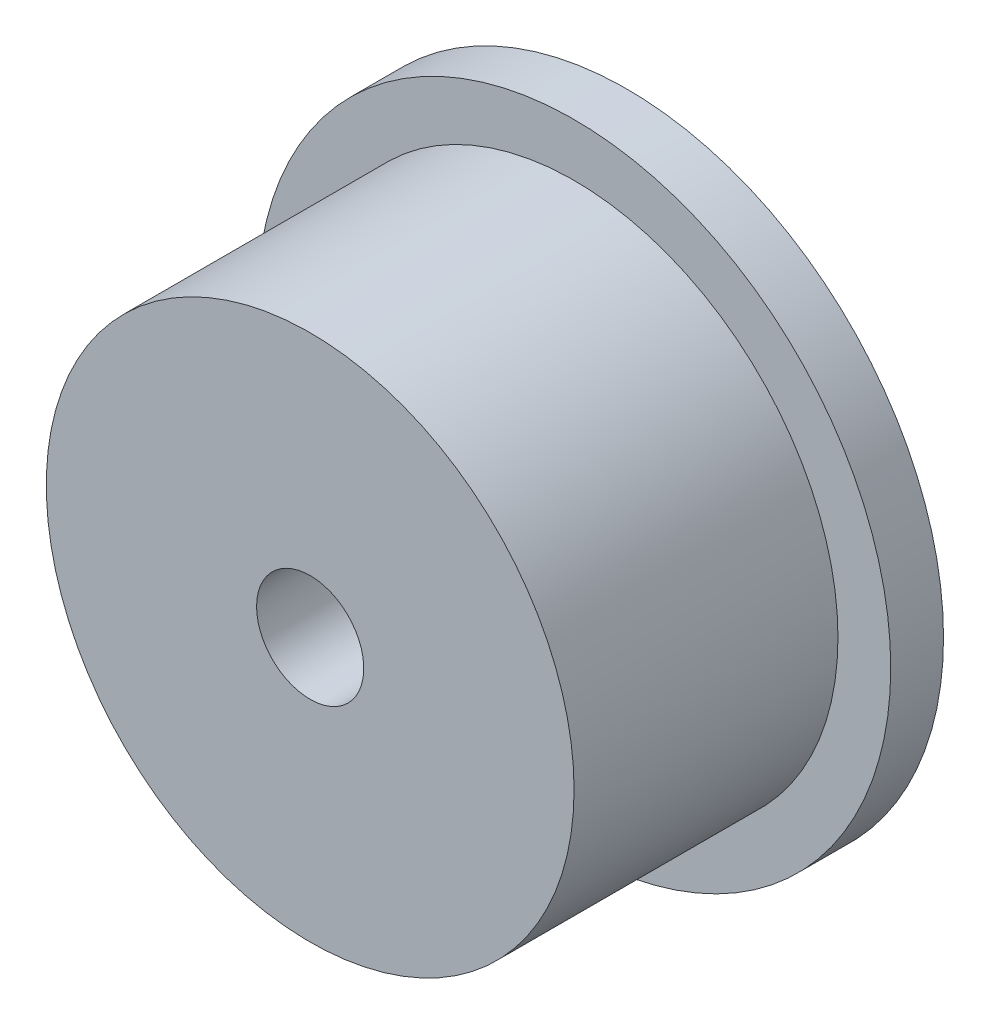
ISO-10303-21;
HEADER;
FILE_DESCRIPTION(('STEP AP214'),'2;1');
FILE_NAME('part.step','',(''),(''),'','','');
FILE_SCHEMA(('AUTOMOTIVE_DESIGN { 1 0 10303 214 1 1 1 1 }'));
ENDSEC;
DATA;
#1=APPLICATION_CONTEXT('core data for automotive mechanical design processes');
#2=APPLICATION_PROTOCOL_DEFINITION('international standard','automotive_design',2000,#1);
#3=PRODUCT_CONTEXT('',#1,'mechanical');
#4=PRODUCT('Part','Part','',(#3));
#5=PRODUCT_RELATED_PRODUCT_CATEGORY('part','',(#4));
#6=PRODUCT_DEFINITION_FORMATION('','',#4);
#7=PRODUCT_DEFINITION_CONTEXT('part definition',#1,'design');
#8=PRODUCT_DEFINITION('design','',#6,#7);
#9=PRODUCT_DEFINITION_SHAPE('','',#8);
#10=(LENGTH_UNIT() NAMED_UNIT(*) SI_UNIT(.MILLI.,.METRE.));
#11=(NAMED_UNIT(*) PLANE_ANGLE_UNIT() SI_UNIT($,.RADIAN.));
#12=(NAMED_UNIT(*) SI_UNIT($,.STERADIAN.) SOLID_ANGLE_UNIT());
#13=UNCERTAINTY_MEASURE_WITH_UNIT(LENGTH_MEASURE(1.E-05),#10,'distance_accuracy_value','');
#14=(GEOMETRIC_REPRESENTATION_CONTEXT(3) GLOBAL_UNCERTAINTY_ASSIGNED_CONTEXT((#13)) GLOBAL_UNIT_ASSIGNED_CONTEXT((#10,
#11,#12)) REPRESENTATION_CONTEXT('',''));
#15=CARTESIAN_POINT('',(0.,0.,0.));
#16=DIRECTION('',(0.,0.,1.));
#17=DIRECTION('',(1.,0.,0.));
#18=AXIS2_PLACEMENT_3D('',#15,#16,#17);
#19=CARTESIAN_POINT('',(0.,0.,-71.1204937027704));
#20=DIRECTION('',(0.,0.,-1.));
#21=DIRECTION('',(-1.,0.,0.));
#22=AXIS2_PLACEMENT_3D('',#19,#20,#21);
#23=CYLINDRICAL_SURFACE('',#22,2.5796875);
#24=CARTESIAN_POINT('',(0.,0.,-71.1204937027704));
#25=DIRECTION('',(0.,0.,-1.));
#26=DIRECTION('',(-1.,0.,0.));
#27=AXIS2_PLACEMENT_3D('',#24,#25,#26);
#28=CIRCLE('',#27,2.5796875);
#29=CARTESIAN_POINT('',(-2.5796875,0.,-71.1204937027704));
#30=VERTEX_POINT('',#29);
#31=EDGE_CURVE('E50',#30,#30,#28,.T.);
#32=ORIENTED_EDGE('',*,*,#31,.F.);
#33=EDGE_LOOP('',(#32));
#34=FACE_BOUND('',#33,.T.);
#35=CARTESIAN_POINT('',(0.,0.,-84.8872937027704));
#36=DIRECTION('',(0.,0.,-1.));
#37=DIRECTION('',(-1.,0.,0.));
#38=AXIS2_PLACEMENT_3D('',#35,#36,#37);
#39=CIRCLE('',#38,2.5796875);
#40=CARTESIAN_POINT('',(-2.5796875,0.,-84.8872937027704));
#41=VERTEX_POINT('',#40);
#42=EDGE_CURVE('E34',#41,#41,#39,.F.);
#43=ORIENTED_EDGE('',*,*,#42,.F.);
#44=EDGE_LOOP('',(#43));
#45=FACE_BOUND('',#44,.T.);
#46=ADVANCED_FACE('F30',(#34,#45),#23,.F.);
#47=CARTESIAN_POINT('',(-12.7,0.,-71.1204937027704));
#48=DIRECTION('',(0.,0.,-1.));
#49=DIRECTION('',(-1.,0.,0.));
#50=AXIS2_PLACEMENT_3D('',#47,#48,#49);
#51=PLANE('',#50);
#52=ORIENTED_EDGE('',*,*,#31,.T.);
#53=EDGE_LOOP('',(#52));
#54=FACE_BOUND('',#53,.T.);
#55=CARTESIAN_POINT('',(0.,0.,-71.1204937027704));
#56=DIRECTION('',(0.,0.,1.));
#57=DIRECTION('',(1.,0.,0.));
#58=AXIS2_PLACEMENT_3D('',#55,#56,#57);
#59=CIRCLE('',#58,12.7);
#60=CARTESIAN_POINT('',(12.7,0.,-71.1204937027704));
#61=VERTEX_POINT('',#60);
#62=EDGE_CURVE('E47',#61,#61,#59,.T.);
#63=ORIENTED_EDGE('',*,*,#62,.T.);
#64=EDGE_LOOP('',(#63));
#65=FACE_BOUND('',#64,.T.);
#66=ADVANCED_FACE('F32',(#54,#65),#51,.F.);
#67=CARTESIAN_POINT('',(0.,0.,-86.3604937027705));
#68=DIRECTION('',(0.,0.,1.));
#69=DIRECTION('',(1.,0.,0.));
#70=AXIS2_PLACEMENT_3D('',#67,#68,#69);
#71=PLANE('',#70);
#72=CARTESIAN_POINT('',(0.,0.,-86.3604937027705));
#73=DIRECTION('',(0.,0.,-1.));
#74=DIRECTION('',(-1.,0.,0.));
#75=AXIS2_PLACEMENT_3D('',#72,#73,#74);
#76=CIRCLE('',#75,4.7625);
#77=CARTESIAN_POINT('',(-4.7625,0.,-86.3604937027705));
#78=VERTEX_POINT('',#77);
#79=EDGE_CURVE('E53',#78,#78,#76,.T.);
#80=ORIENTED_EDGE('',*,*,#79,.F.);
#81=EDGE_LOOP('',(#80));
#82=FACE_BOUND('',#81,.T.);
#83=CARTESIAN_POINT('',(0.,0.,-86.3604937027705));
#84=DIRECTION('',(0.,0.,1.));
#85=DIRECTION('',(1.,0.,0.));
#86=AXIS2_PLACEMENT_3D('',#83,#84,#85);
#87=CIRCLE('',#86,15.24);
#88=CARTESIAN_POINT('',(15.24,0.,-86.3604937027705));
#89=VERTEX_POINT('',#88);
#90=EDGE_CURVE('E10',#89,#89,#87,.T.);
#91=ORIENTED_EDGE('',*,*,#90,.F.);
#92=EDGE_LOOP('',(#91));
#93=FACE_BOUND('',#92,.T.);
#94=ADVANCED_FACE('F71',(#82,#93),#71,.F.);
#95=CARTESIAN_POINT('',(0.,0.,0.));
#96=DIRECTION('',(0.,0.,1.));
#97=DIRECTION('',(1.,0.,0.));
#98=AXIS2_PLACEMENT_3D('',#95,#96,#97);
#99=CYLINDRICAL_SURFACE('',#98,15.24);
#100=CARTESIAN_POINT('',(0.,0.,-83.8204937027704));
#101=DIRECTION('',(0.,0.,1.));
#102=DIRECTION('',(1.,0.,0.));
#103=AXIS2_PLACEMENT_3D('',#100,#101,#102);
#104=CIRCLE('',#103,15.24);
#105=CARTESIAN_POINT('',(15.24,0.,-83.8204937027704));
#106=VERTEX_POINT('',#105);
#107=EDGE_CURVE('E38',#106,#106,#104,.T.);
#108=ORIENTED_EDGE('',*,*,#107,.F.);
#109=EDGE_LOOP('',(#108));
#110=FACE_BOUND('',#109,.T.);
#111=ORIENTED_EDGE('',*,*,#90,.T.);
#112=EDGE_LOOP('',(#111));
#113=FACE_BOUND('',#112,.T.);
#114=ADVANCED_FACE('F85',(#110,#113),#99,.T.);
#115=CARTESIAN_POINT('',(-15.24,0.,-83.8204937027704));
#116=DIRECTION('',(0.,0.,-1.));
#117=DIRECTION('',(-1.,0.,0.));
#118=AXIS2_PLACEMENT_3D('',#115,#116,#117);
#119=PLANE('',#118);
#120=CARTESIAN_POINT('',(0.,0.,-83.8204937027704));
#121=DIRECTION('',(0.,0.,1.));
#122=DIRECTION('',(1.,0.,0.));
#123=AXIS2_PLACEMENT_3D('',#120,#121,#122);
#124=CIRCLE('',#123,12.7);
#125=CARTESIAN_POINT('',(12.7,0.,-83.8204937027704));
#126=VERTEX_POINT('',#125);
#127=EDGE_CURVE('E42',#126,#126,#124,.T.);
#128=ORIENTED_EDGE('',*,*,#127,.F.);
#129=EDGE_LOOP('',(#128));
#130=FACE_BOUND('',#129,.T.);
#131=ORIENTED_EDGE('',*,*,#107,.T.);
#132=EDGE_LOOP('',(#131));
#133=FACE_BOUND('',#132,.T.);
#134=ADVANCED_FACE('F81',(#130,#133),#119,.F.);
#135=CARTESIAN_POINT('',(0.,0.,0.));
#136=DIRECTION('',(0.,0.,1.));
#137=DIRECTION('',(1.,0.,0.));
#138=AXIS2_PLACEMENT_3D('',#135,#136,#137);
#139=CYLINDRICAL_SURFACE('',#138,12.7);
#140=ORIENTED_EDGE('',*,*,#62,.F.);
#141=EDGE_LOOP('',(#140));
#142=FACE_BOUND('',#141,.T.);
#143=ORIENTED_EDGE('',*,*,#127,.T.);
#144=EDGE_LOOP('',(#143));
#145=FACE_BOUND('',#144,.T.);
#146=ADVANCED_FACE('F78',(#142,#145),#139,.T.);
#147=CARTESIAN_POINT('',(0.,0.,-84.8872937027704));
#148=DIRECTION('',(0.,0.,-1.));
#149=DIRECTION('',(-1.,0.,0.));
#150=AXIS2_PLACEMENT_3D('',#147,#148,#149);
#151=PLANE('',#150);
#152=CARTESIAN_POINT('',(0.,0.,-84.8872937027704));
#153=DIRECTION('',(0.,0.,-1.));
#154=DIRECTION('',(-1.,0.,0.));
#155=AXIS2_PLACEMENT_3D('',#152,#153,#154);
#156=CIRCLE('',#155,4.7625);
#157=CARTESIAN_POINT('',(-4.7625,0.,-84.8872937027704));
#158=VERTEX_POINT('',#157);
#159=EDGE_CURVE('E56',#158,#158,#156,.T.);
#160=ORIENTED_EDGE('',*,*,#159,.T.);
#161=EDGE_LOOP('',(#160));
#162=FACE_BOUND('',#161,.T.);
#163=ORIENTED_EDGE('',*,*,#42,.T.);
#164=EDGE_LOOP('',(#163));
#165=FACE_BOUND('',#164,.T.);
#166=ADVANCED_FACE('F63',(#162,#165),#151,.T.);
#167=CARTESIAN_POINT('',(0.,0.,-84.8872937027704));
#168=DIRECTION('',(0.,0.,-1.));
#169=DIRECTION('',(-1.,0.,0.));
#170=AXIS2_PLACEMENT_3D('',#167,#168,#169);
#171=CYLINDRICAL_SURFACE('',#170,4.7625);
#172=ORIENTED_EDGE('',*,*,#159,.F.);
#173=EDGE_LOOP('',(#172));
#174=FACE_BOUND('',#173,.T.);
#175=ORIENTED_EDGE('',*,*,#79,.T.);
#176=EDGE_LOOP('',(#175));
#177=FACE_BOUND('',#176,.T.);
#178=ADVANCED_FACE('F76',(#174,#177),#171,.F.);
#179=CLOSED_SHELL('',(#46,#66,#94,#114,#134,#146,#166,#178));
#180=MANIFOLD_SOLID_BREP('B2',#179);
#181=ADVANCED_BREP_SHAPE_REPRESENTATION('',(#18,#180),#14);
#182=SHAPE_DEFINITION_REPRESENTATION(#9,#181);
ENDSEC;
END-ISO-10303-21;
